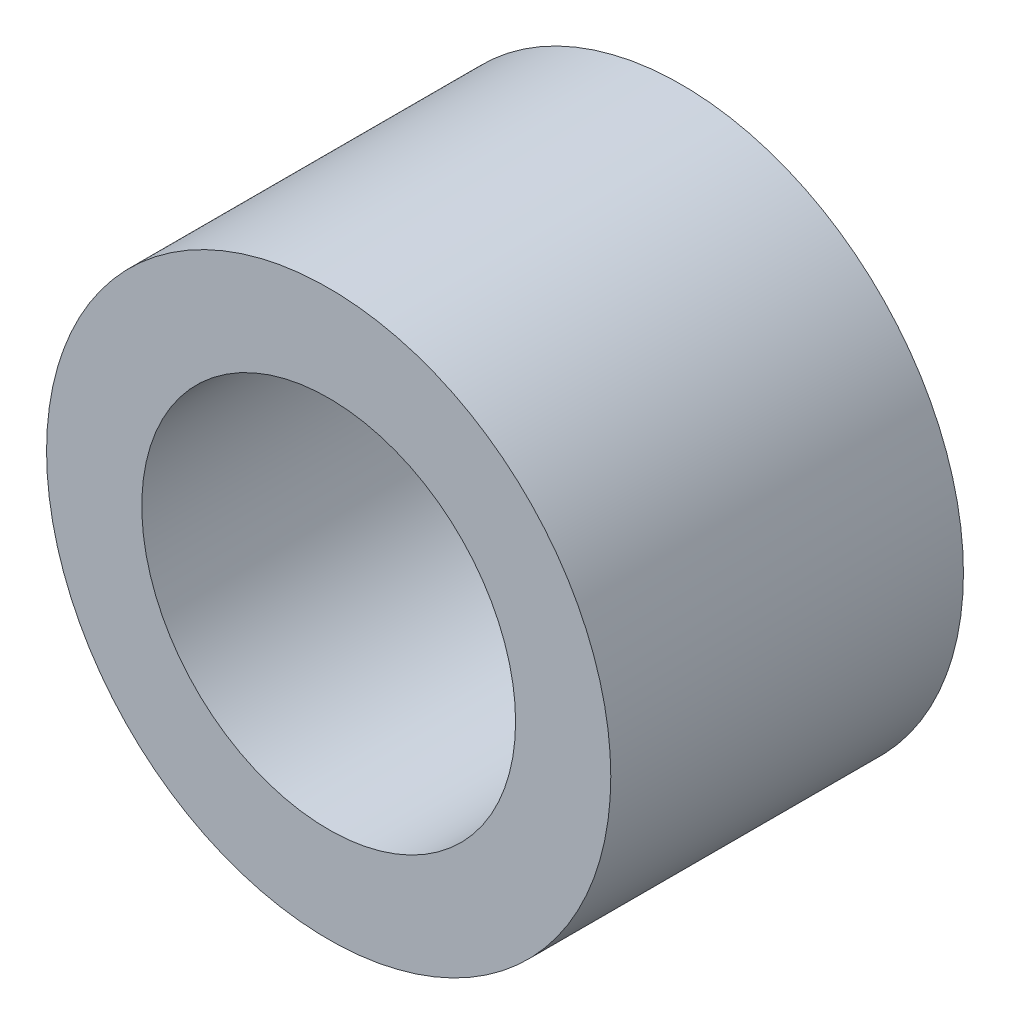
ISO-10303-21;
HEADER;
FILE_DESCRIPTION(('STEP AP214'),'2;1');
FILE_NAME('part.step','',(''),(''),'','','');
FILE_SCHEMA(('AUTOMOTIVE_DESIGN { 1 0 10303 214 1 1 1 1 }'));
ENDSEC;
DATA;
#1=APPLICATION_CONTEXT('core data for automotive mechanical design processes');
#2=APPLICATION_PROTOCOL_DEFINITION('international standard','automotive_design',2000,#1);
#3=PRODUCT_CONTEXT('',#1,'mechanical');
#4=PRODUCT('Part','Part','',(#3));
#5=PRODUCT_RELATED_PRODUCT_CATEGORY('part','',(#4));
#6=PRODUCT_DEFINITION_FORMATION('','',#4);
#7=PRODUCT_DEFINITION_CONTEXT('part definition',#1,'design');
#8=PRODUCT_DEFINITION('design','',#6,#7);
#9=PRODUCT_DEFINITION_SHAPE('','',#8);
#10=(LENGTH_UNIT() NAMED_UNIT(*) SI_UNIT(.MILLI.,.METRE.));
#11=(NAMED_UNIT(*) PLANE_ANGLE_UNIT() SI_UNIT($,.RADIAN.));
#12=(NAMED_UNIT(*) SI_UNIT($,.STERADIAN.) SOLID_ANGLE_UNIT());
#13=UNCERTAINTY_MEASURE_WITH_UNIT(LENGTH_MEASURE(1.E-05),#10,'distance_accuracy_value','');
#14=(GEOMETRIC_REPRESENTATION_CONTEXT(3) GLOBAL_UNCERTAINTY_ASSIGNED_CONTEXT((#13)) GLOBAL_UNIT_ASSIGNED_CONTEXT((#10,
#11,#12)) REPRESENTATION_CONTEXT('',''));
#15=CARTESIAN_POINT('',(0.,0.,0.));
#16=DIRECTION('',(0.,0.,1.));
#17=DIRECTION('',(1.,0.,0.));
#18=AXIS2_PLACEMENT_3D('',#15,#16,#17);
#19=CARTESIAN_POINT('',(0.,0.,2.5));
#20=DIRECTION('',(0.,0.,1.));
#21=DIRECTION('',(1.,0.,0.));
#22=AXIS2_PLACEMENT_3D('',#19,#20,#21);
#23=PLANE('',#22);
#24=CARTESIAN_POINT('',(0.,0.,2.5));
#25=DIRECTION('',(0.,0.,1.));
#26=DIRECTION('',(1.,0.,0.));
#27=AXIS2_PLACEMENT_3D('',#24,#25,#26);
#28=CIRCLE('',#27,4.);
#29=CARTESIAN_POINT('',(4.,0.,2.5));
#30=VERTEX_POINT('',#29);
#31=EDGE_CURVE('E10',#30,#30,#28,.T.);
#32=ORIENTED_EDGE('',*,*,#31,.T.);
#33=EDGE_LOOP('',(#32));
#34=FACE_BOUND('',#33,.T.);
#35=CARTESIAN_POINT('',(0.,0.,2.5));
#36=DIRECTION('',(0.,0.,1.));
#37=DIRECTION('',(1.,0.,0.));
#38=AXIS2_PLACEMENT_3D('',#35,#36,#37);
#39=CIRCLE('',#38,2.65);
#40=CARTESIAN_POINT('',(2.65,0.,2.5));
#41=VERTEX_POINT('',#40);
#42=EDGE_CURVE('E40',#41,#41,#39,.T.);
#43=ORIENTED_EDGE('',*,*,#42,.F.);
#44=EDGE_LOOP('',(#43));
#45=FACE_BOUND('',#44,.T.);
#46=ADVANCED_FACE('F29',(#34,#45),#23,.T.);
#47=CARTESIAN_POINT('',(0.,0.,-2.5));
#48=DIRECTION('',(0.,0.,1.));
#49=DIRECTION('',(1.,0.,0.));
#50=AXIS2_PLACEMENT_3D('',#47,#48,#49);
#51=PLANE('',#50);
#52=CARTESIAN_POINT('',(0.,0.,-2.5));
#53=DIRECTION('',(0.,0.,1.));
#54=DIRECTION('',(1.,0.,0.));
#55=AXIS2_PLACEMENT_3D('',#52,#53,#54);
#56=CIRCLE('',#55,4.);
#57=CARTESIAN_POINT('',(4.,0.,-2.5));
#58=VERTEX_POINT('',#57);
#59=EDGE_CURVE('E33',#58,#58,#56,.T.);
#60=ORIENTED_EDGE('',*,*,#59,.F.);
#61=EDGE_LOOP('',(#60));
#62=FACE_BOUND('',#61,.T.);
#63=CARTESIAN_POINT('',(0.,0.,-2.5));
#64=DIRECTION('',(0.,0.,1.));
#65=DIRECTION('',(1.,0.,0.));
#66=AXIS2_PLACEMENT_3D('',#63,#64,#65);
#67=CIRCLE('',#66,2.65);
#68=CARTESIAN_POINT('',(2.65,0.,-2.5));
#69=VERTEX_POINT('',#68);
#70=EDGE_CURVE('E42',#69,#69,#67,.T.);
#71=ORIENTED_EDGE('',*,*,#70,.T.);
#72=EDGE_LOOP('',(#71));
#73=FACE_BOUND('',#72,.T.);
#74=ADVANCED_FACE('F52',(#62,#73),#51,.F.);
#75=CARTESIAN_POINT('',(0.,0.,2.5));
#76=DIRECTION('',(0.,0.,-1.));
#77=DIRECTION('',(-1.,0.,0.));
#78=AXIS2_PLACEMENT_3D('',#75,#76,#77);
#79=CYLINDRICAL_SURFACE('',#78,4.);
#80=ORIENTED_EDGE('',*,*,#31,.F.);
#81=EDGE_LOOP('',(#80));
#82=FACE_BOUND('',#81,.T.);
#83=ORIENTED_EDGE('',*,*,#59,.T.);
#84=EDGE_LOOP('',(#83));
#85=FACE_BOUND('',#84,.T.);
#86=ADVANCED_FACE('F31',(#82,#85),#79,.T.);
#87=CARTESIAN_POINT('',(0.,0.,2.5));
#88=DIRECTION('',(0.,0.,-1.));
#89=DIRECTION('',(-1.,0.,0.));
#90=AXIS2_PLACEMENT_3D('',#87,#88,#89);
#91=CYLINDRICAL_SURFACE('',#90,2.65);
#92=ORIENTED_EDGE('',*,*,#42,.T.);
#93=EDGE_LOOP('',(#92));
#94=FACE_BOUND('',#93,.T.);
#95=ORIENTED_EDGE('',*,*,#70,.F.);
#96=EDGE_LOOP('',(#95));
#97=FACE_BOUND('',#96,.T.);
#98=ADVANCED_FACE('F48',(#94,#97),#91,.F.);
#99=CLOSED_SHELL('',(#46,#74,#86,#98));
#100=MANIFOLD_SOLID_BREP('B2',#99);
#101=ADVANCED_BREP_SHAPE_REPRESENTATION('',(#18,#100),#14);
#102=SHAPE_DEFINITION_REPRESENTATION(#9,#101);
ENDSEC;
END-ISO-10303-21;
